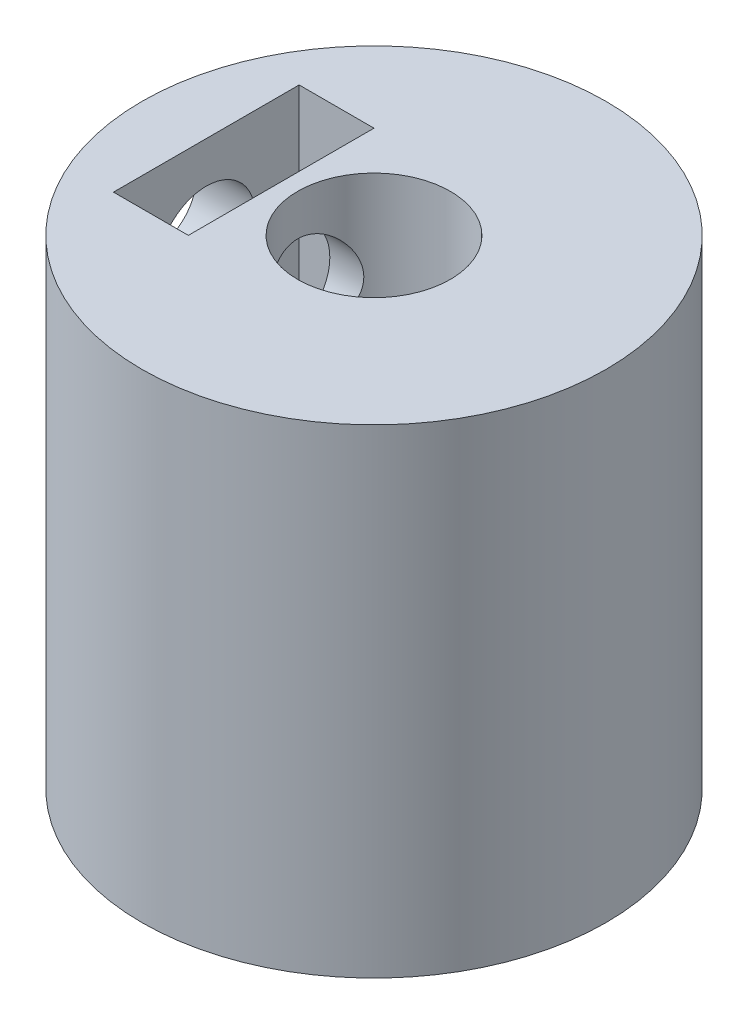
ISO-10303-21;
HEADER;
FILE_DESCRIPTION(('STEP AP214'),'2;1');
FILE_NAME('part.step','',(''),(''),'','','');
FILE_SCHEMA(('AUTOMOTIVE_DESIGN { 1 0 10303 214 1 1 1 1 }'));
ENDSEC;
DATA;
#1=APPLICATION_CONTEXT('core data for automotive mechanical design processes');
#2=APPLICATION_PROTOCOL_DEFINITION('international standard','automotive_design',2000,#1);
#3=PRODUCT_CONTEXT('',#1,'mechanical');
#4=PRODUCT('Part','Part','',(#3));
#5=PRODUCT_RELATED_PRODUCT_CATEGORY('part','',(#4));
#6=PRODUCT_DEFINITION_FORMATION('','',#4);
#7=PRODUCT_DEFINITION_CONTEXT('part definition',#1,'design');
#8=PRODUCT_DEFINITION('design','',#6,#7);
#9=PRODUCT_DEFINITION_SHAPE('','',#8);
#10=(LENGTH_UNIT() NAMED_UNIT(*) SI_UNIT(.MILLI.,.METRE.));
#11=(NAMED_UNIT(*) PLANE_ANGLE_UNIT() SI_UNIT($,.RADIAN.));
#12=(NAMED_UNIT(*) SI_UNIT($,.STERADIAN.) SOLID_ANGLE_UNIT());
#13=UNCERTAINTY_MEASURE_WITH_UNIT(LENGTH_MEASURE(1.E-05),#10,'distance_accuracy_value','');
#14=(GEOMETRIC_REPRESENTATION_CONTEXT(3) GLOBAL_UNCERTAINTY_ASSIGNED_CONTEXT((#13)) GLOBAL_UNIT_ASSIGNED_CONTEXT((#10,
#11,#12)) REPRESENTATION_CONTEXT('',''));
#15=CARTESIAN_POINT('',(0.,0.,0.));
#16=DIRECTION('',(0.,0.,1.));
#17=DIRECTION('',(1.,0.,0.));
#18=AXIS2_PLACEMENT_3D('',#15,#16,#17);
#19=CARTESIAN_POINT('',(0.,8.,0.));
#20=DIRECTION('',(0.,1.,0.));
#21=DIRECTION('',(0.,0.,1.));
#22=AXIS2_PLACEMENT_3D('',#19,#20,#21);
#23=PLANE('',#22);
#24=CARTESIAN_POINT('',(0.,8.,0.));
#25=DIRECTION('',(0.,1.,0.));
#26=DIRECTION('',(0.,0.,1.));
#27=AXIS2_PLACEMENT_3D('',#24,#25,#26);
#28=CIRCLE('',#27,2.55);
#29=CARTESIAN_POINT('',(0.,8.,2.55));
#30=VERTEX_POINT('',#29);
#31=EDGE_CURVE('E231',#30,#30,#28,.T.);
#32=ORIENTED_EDGE('',*,*,#31,.F.);
#33=EDGE_LOOP('',(#32));
#34=FACE_BOUND('',#33,.T.);
#35=CARTESIAN_POINT('',(0.,8.,0.));
#36=DIRECTION('',(0.,1.,0.));
#37=DIRECTION('',(0.,0.,1.));
#38=AXIS2_PLACEMENT_3D('',#35,#36,#37);
#39=CIRCLE('',#38,7.75);
#40=CARTESIAN_POINT('',(0.,8.,7.75));
#41=VERTEX_POINT('',#40);
#42=EDGE_CURVE('E235',#41,#41,#39,.T.);
#43=ORIENTED_EDGE('',*,*,#42,.T.);
#44=EDGE_LOOP('',(#43));
#45=FACE_BOUND('',#44,.T.);
#46=DIRECTION('',(1.,0.,0.));
#47=VECTOR('',#46,1.);
#48=CARTESIAN_POINT('',(-5.6,8.,3.1));
#49=LINE('',#48,#47);
#50=CARTESIAN_POINT('',(-5.6,8.,3.1));
#51=VERTEX_POINT('',#50);
#52=CARTESIAN_POINT('',(-3.1,8.,3.1));
#53=VERTEX_POINT('',#52);
#54=EDGE_CURVE('E140',#51,#53,#49,.T.);
#55=ORIENTED_EDGE('',*,*,#54,.F.);
#56=DIRECTION('',(0.,0.,1.));
#57=VECTOR('',#56,1.);
#58=CARTESIAN_POINT('',(-5.6,8.,-3.1));
#59=LINE('',#58,#57);
#60=CARTESIAN_POINT('',(-5.6,8.,-3.1));
#61=VERTEX_POINT('',#60);
#62=EDGE_CURVE('E113',#61,#51,#59,.T.);
#63=ORIENTED_EDGE('',*,*,#62,.F.);
#64=DIRECTION('',(1.,0.,0.));
#65=VECTOR('',#64,1.);
#66=CARTESIAN_POINT('',(-5.6,8.,-3.1));
#67=LINE('',#66,#65);
#68=CARTESIAN_POINT('',(-3.1,8.,-3.1));
#69=VERTEX_POINT('',#68);
#70=EDGE_CURVE('E143',#61,#69,#67,.T.);
#71=ORIENTED_EDGE('',*,*,#70,.T.);
#72=DIRECTION('',(0.,0.,1.));
#73=VECTOR('',#72,1.);
#74=CARTESIAN_POINT('',(-3.1,8.,-3.1));
#75=LINE('',#74,#73);
#76=EDGE_CURVE('E127',#69,#53,#75,.T.);
#77=ORIENTED_EDGE('',*,*,#76,.T.);
#78=EDGE_LOOP('',(#55,#63,#71,#77));
#79=FACE_BOUND('',#78,.T.);
#80=ADVANCED_FACE('F34',(#34,#45,#79),#23,.T.);
#81=CARTESIAN_POINT('',(-20.5,-5.,0.));
#82=DIRECTION('',(1.,0.,0.));
#83=DIRECTION('',(0.,0.,-1.));
#84=AXIS2_PLACEMENT_3D('',#81,#82,#83);
#85=CYLINDRICAL_SURFACE('',#84,1.625);
#86=CARTESIAN_POINT('',(-1.96516538744198,-5.,-1.625));
#87=CARTESIAN_POINT('',(-1.9651777495956,-5.08038266060624,-1.62499241951799));
#88=CARTESIAN_POINT('',(-1.97018801485205,-5.16083573427423,-1.61898407358667));
#89=CARTESIAN_POINT('',(-1.98931986532997,-5.31895886035241,-1.59540502363238));
#90=CARTESIAN_POINT('',(-2.00345932830343,-5.3966231357439,-1.57781163121016));
#91=CARTESIAN_POINT('',(-2.03842904176531,-5.54643663047045,-1.53235534627922));
#92=CARTESIAN_POINT('',(-2.05920047044041,-5.61862767694942,-1.50458243140975));
#93=CARTESIAN_POINT('',(-2.10499227311706,-5.75723612790105,-1.43981883091727));
#94=CARTESIAN_POINT('',(-2.13001351438201,-5.82365234970856,-1.4028262631091));
#95=CARTESIAN_POINT('',(-2.185704877213,-5.95903991323918,-1.31463952129205));
#96=CARTESIAN_POINT('',(-2.21667522302638,-6.02706482324539,-1.26218160511581));
#97=CARTESIAN_POINT('',(-2.27834675013153,-6.15415559751042,-1.14712897760829));
#98=CARTESIAN_POINT('',(-2.30904767433442,-6.2132136306856,-1.08452550332085));
#99=CARTESIAN_POINT('',(-2.37133975131212,-6.32815609653209,-0.941322199016962));
#100=CARTESIAN_POINT('',(-2.40254675703229,-6.38267959358617,-0.859445953513414));
#101=CARTESIAN_POINT('',(-2.45787725112131,-6.47672970567766,-0.685312447786562));
#102=CARTESIAN_POINT('',(-2.48200797005701,-6.5162716410635,-0.593065918254888));
#103=CARTESIAN_POINT('',(-2.51818797230923,-6.57475837972704,-0.410998491877256));
#104=CARTESIAN_POINT('',(-2.53123793769468,-6.59542672919694,-0.321935516470099));
#105=CARTESIAN_POINT('',(-2.54772965090739,-6.62146800801774,-0.140761256765256));
#106=CARTESIAN_POINT('',(-2.55118205611016,-6.6268579030849,-0.0486534686486843));
#107=CARTESIAN_POINT('',(-2.5483042190585,-6.62233624860543,0.122107713885255));
#108=CARTESIAN_POINT('',(-2.54327016245075,-6.61445231398725,0.200847370748513));
#109=CARTESIAN_POINT('',(-2.52628056532954,-6.58755402290214,0.355619536125331));
#110=CARTESIAN_POINT('',(-2.51432450485016,-6.56853883027805,0.431651840812965));
#111=CARTESIAN_POINT('',(-2.48449603879295,-6.52026463148926,0.579186024340183));
#112=CARTESIAN_POINT('',(-2.46661890290692,-6.49099743398483,0.650684226325551));
#113=CARTESIAN_POINT('',(-2.42631281008093,-6.42332594326026,0.787793877596566));
#114=CARTESIAN_POINT('',(-2.40388288280599,-6.38491970193741,0.853404067666017));
#115=CARTESIAN_POINT('',(-2.35294468811187,-6.29461932898805,0.985797470965052));
#116=CARTESIAN_POINT('',(-2.32402636903217,-6.24163289726313,1.05167642035341));
#117=CARTESIAN_POINT('',(-2.26460512659315,-6.12649695438483,1.17418544351358));
#118=CARTESIAN_POINT('',(-2.23409988554345,-6.06433378266232,1.23080145884505));
#119=CARTESIAN_POINT('',(-2.16990067600904,-5.92257130839874,1.34113248943147));
#120=CARTESIAN_POINT('',(-2.13634692324536,-5.84174969270578,1.39337138672418));
#121=CARTESIAN_POINT('',(-2.07487148297598,-5.67048727014074,1.48336973768388));
#122=CARTESIAN_POINT('',(-2.04693960621195,-5.58006432795841,1.52115550068513));
#123=CARTESIAN_POINT('',(-2.00780033110716,-5.4169471671801,1.57225368592951));
#124=CARTESIAN_POINT('',(-1.99411349186395,-5.3460592686623,1.58941949060232));
#125=CARTESIAN_POINT('',(-1.97419525844224,-5.20163992820011,1.614098206648));
#126=CARTESIAN_POINT('',(-1.9679528970052,-5.12811253980566,1.6216253190217));
#127=CARTESIAN_POINT('',(-1.96387189510528,-4.98026741916364,1.62656707381513));
#128=CARTESIAN_POINT('',(-1.96605694958116,-4.9059480452365,1.62395320322417));
#129=CARTESIAN_POINT('',(-1.97852813965092,-4.75901232691797,1.60873120169692));
#130=CARTESIAN_POINT('',(-1.98882105007509,-4.68639745907041,1.59611471263157));
#131=CARTESIAN_POINT('',(-2.0156623096275,-4.5465372842733,1.56206732730421));
#132=CARTESIAN_POINT('',(-2.03204725076701,-4.47920297189759,1.54086549818665));
#133=CARTESIAN_POINT('',(-2.06926910903875,-4.34891995312157,1.49050450986105));
#134=CARTESIAN_POINT('',(-2.09010750935643,-4.2859727170831,1.46134269875178));
#135=CARTESIAN_POINT('',(-2.13876923763544,-4.15325169888539,1.38938681685538));
#136=CARTESIAN_POINT('',(-2.16716310249829,-4.08452687168844,1.34504506764347));
#137=CARTESIAN_POINT('',(-2.22511188320518,-3.95471319008126,1.24685008499367));
#138=CARTESIAN_POINT('',(-2.25466814026529,-3.89363351818756,1.19298559762631));
#139=CARTESIAN_POINT('',(-2.31772916194698,-3.76983215740194,1.06606595014288));
#140=CARTESIAN_POINT('',(-2.3510084294412,-3.70872853343524,0.991301594544217));
#141=CARTESIAN_POINT('',(-2.41243358452782,-3.6000115699649,0.830680905234968));
#142=CARTESIAN_POINT('',(-2.44058516683697,-3.55238323210329,0.744837059562022));
#143=CARTESIAN_POINT('',(-2.48378930835388,-3.48079905354294,0.582145592184213));
#144=CARTESIAN_POINT('',(-2.50033614870532,-3.45401248797799,0.506939961842522));
#145=CARTESIAN_POINT('',(-2.52675699754254,-3.41163502773412,0.352323981537021));
#146=CARTESIAN_POINT('',(-2.53663632844209,-3.39603520249127,0.27291704005655));
#147=CARTESIAN_POINT('',(-2.54883100043065,-3.37681776670653,0.111819355355441));
#148=CARTESIAN_POINT('',(-2.55112241160253,-3.37323806335995,0.03012220483019));
#149=CARTESIAN_POINT('',(-2.54784530754677,-3.37838206339879,-0.132729217797065));
#150=CARTESIAN_POINT('',(-2.54227610025932,-3.3871068500886,-0.213883441466977));
#151=CARTESIAN_POINT('',(-2.52428609288949,-3.41562039634327,-0.369179388768185));
#152=CARTESIAN_POINT('',(-2.51221871401568,-3.4348391101114,-0.443469296679646));
#153=CARTESIAN_POINT('',(-2.48247015925824,-3.48304847458908,-0.587589897126411));
#154=CARTESIAN_POINT('',(-2.46478807116174,-3.5120407132349,-0.657419862846109));
#155=CARTESIAN_POINT('',(-2.42355384453705,-3.58134764803054,-0.796589314418045));
#156=CARTESIAN_POINT('',(-2.39965365250793,-3.62236423324208,-0.865473796637177));
#157=CARTESIAN_POINT('',(-2.34860040455858,-3.7133503860364,-0.995731034656254));
#158=CARTESIAN_POINT('',(-2.32144472488567,-3.76332719138044,-1.0570976498193));
#159=CARTESIAN_POINT('',(-2.26155128443658,-3.87947010391925,-1.18036511761868));
#160=CARTESIAN_POINT('',(-2.22859227356778,-3.94694225405403,-1.24093057122332));
#161=CARTESIAN_POINT('',(-2.16405507864855,-4.09146381250273,-1.35033345227475));
#162=CARTESIAN_POINT('',(-2.13247726229956,-4.16851575042024,-1.39916777201742));
#163=CARTESIAN_POINT('',(-2.0786664944871,-4.31941450852961,-1.47769207063656));
#164=CARTESIAN_POINT('',(-2.0557424072431,-4.39210023492175,-1.50913274574658));
#165=CARTESIAN_POINT('',(-2.01635737214433,-4.54277214100537,-1.56137263897716));
#166=CARTESIAN_POINT('',(-1.99987938851511,-4.62074370179198,-1.58219995086419));
#167=CARTESIAN_POINT('',(-1.98047635297883,-4.74946249557526,-1.60634636463587));
#168=CARTESIAN_POINT('',(-1.97477575032653,-4.79912914964704,-1.61331920529646));
#169=CARTESIAN_POINT('',(-1.96711625613034,-4.89918793347215,-1.62264856616414));
#170=CARTESIAN_POINT('',(-1.96515763330249,-4.94958011506469,-1.62500475484424));
#171=CARTESIAN_POINT('',(-1.96516538744198,-5.,-1.625));
#172=B_SPLINE_CURVE_WITH_KNOTS('',3,(#86,#87,#88,#89,#90,#91,#92,#93,#94,#95,#96,#97,#98,#99,
#100,#101,#102,#103,#104,#105,#106,#107,#108,#109,#110,#111,#112,#113,#114,#115,#116,#117,#118,
#119,#120,#121,#122,#123,#124,#125,#126,#127,#128,#129,#130,#131,#132,#133,#134,#135,#136,#137,
#138,#139,#140,#141,#142,#143,#144,#145,#146,#147,#148,#149,#150,#151,#152,#153,#154,#155,#156,
#157,#158,#159,#160,#161,#162,#163,#164,#165,#166,#167,#168,#169,#170,#171),.UNSPECIFIED.,.T.,
.F.,(4,2,2,2,2,2,2,2,2,2,2,2,2,2,2,2,2,2,2,2,2,2,2,2,2,2,2,2,2,2,2,2,2,2,2,2,2,2,2,2,2,2,4),(0.,
0.240920473653112,0.482314179923977,0.721623709846711,0.960982134704146,1.23388638722119,
1.50702762225861,1.81493799229473,2.12253263364239,2.39790990977056,2.67298127757442,
2.90972101410114,3.14647853631163,3.38342566062039,3.62042333852061,3.88744329531325,
4.15486482502625,4.45915564708659,4.76288989602745,4.98460375980739,5.20599058802883,
5.42800033155198,5.65019578087639,5.8668170170039,6.08351050967008,6.34229449512456,
6.60138638002577,6.90627441951303,7.21082176324551,7.45436980670092,7.69772320453123,
7.94184333537599,8.18598496023823,8.41802108232316,8.65009492225344,8.90010468187649,
9.15031730829315,9.43854552693216,9.72685001634639,9.97326281223881,10.2190199159535,
10.3701260159542,10.5212429666564),.UNSPECIFIED.);
#173=CARTESIAN_POINT('',(-1.96516538744198,-5.,-1.625));
#174=VERTEX_POINT('',#173);
#175=EDGE_CURVE('E176',#174,#174,#172,.T.);
#176=ORIENTED_EDGE('',*,*,#175,.F.);
#177=EDGE_LOOP('',(#176));
#178=FACE_BOUND('',#177,.T.);
#179=CARTESIAN_POINT('',(-3.1,-5.,0.));
#180=DIRECTION('',(-1.,0.,0.));
#181=DIRECTION('',(0.,0.,1.));
#182=AXIS2_PLACEMENT_3D('',#179,#180,#181);
#183=CIRCLE('',#182,1.625);
#184=CARTESIAN_POINT('',(-3.1,-5.,1.625));
#185=VERTEX_POINT('',#184);
#186=EDGE_CURVE('E279',#185,#185,#183,.F.);
#187=ORIENTED_EDGE('',*,*,#186,.F.);
#188=EDGE_LOOP('',(#187));
#189=FACE_BOUND('',#188,.T.);
#190=ADVANCED_FACE('F196',(#178,#189),#85,.F.);
#191=CARTESIAN_POINT('',(-20.5,5.,0.));
#192=DIRECTION('',(1.,0.,0.));
#193=DIRECTION('',(0.,0.,-1.));
#194=AXIS2_PLACEMENT_3D('',#191,#192,#193);
#195=CYLINDRICAL_SURFACE('',#194,1.625);
#196=CARTESIAN_POINT('',(-7.57772228311384,5.,-1.625));
#197=CARTESIAN_POINT('',(-7.5777240985674,4.90980612938822,-1.62499677846791));
#198=CARTESIAN_POINT('',(-7.57935010639968,4.81957263816137,-1.61746530750281));
#199=CARTESIAN_POINT('',(-7.58566768965246,4.64166509219679,-1.58756748986125));
#200=CARTESIAN_POINT('',(-7.59036159795978,4.55399303826648,-1.56518985369802));
#201=CARTESIAN_POINT('',(-7.60226052986961,4.38380777292506,-1.50632978558656));
#202=CARTESIAN_POINT('',(-7.60946292496147,4.30128926770581,-1.46986211348495));
#203=CARTESIAN_POINT('',(-7.6255641585604,4.14354185603373,-1.38389852226216));
#204=CARTESIAN_POINT('',(-7.63446293278317,4.06831267351487,-1.33440309680066));
#205=CARTESIAN_POINT('',(-7.65310867348377,3.92610840921211,-1.2229695302804));
#206=CARTESIAN_POINT('',(-7.66286573582819,3.85926303096892,-1.16086753177424));
#207=CARTESIAN_POINT('',(-7.6820400615856,3.73685803498958,-1.02633755019323));
#208=CARTESIAN_POINT('',(-7.69145729984884,3.68129925115017,-0.953908804811147));
#209=CARTESIAN_POINT('',(-7.70900034281084,3.58253628572523,-0.799916946308263));
#210=CARTESIAN_POINT('',(-7.71711284966997,3.53945612200807,-0.718272649062821));
#211=CARTESIAN_POINT('',(-7.73101863903009,3.46767460440972,-0.548705453244297));
#212=CARTESIAN_POINT('',(-7.73681216037019,3.43897176968874,-0.46078320235573));
#213=CARTESIAN_POINT('',(-7.74535587107382,3.39716556677439,-0.282503297755103));
#214=CARTESIAN_POINT('',(-7.74814879992281,3.3838429179729,-0.19219914735783));
#215=CARTESIAN_POINT('',(-7.7505244862857,3.37249038642778,-0.0105972239904142));
#216=CARTESIAN_POINT('',(-7.75010758246493,3.37445889033442,0.0807004431400752));
#217=CARTESIAN_POINT('',(-7.74614346525646,3.39346798740791,0.260188543333904));
#218=CARTESIAN_POINT('',(-7.74264532621138,3.41027230262892,0.348405242395991));
#219=CARTESIAN_POINT('',(-7.73296741782681,3.45810035648581,0.520738127781115));
#220=CARTESIAN_POINT('',(-7.72678753390875,3.48912470268112,0.604854138729862));
#221=CARTESIAN_POINT('',(-7.71236061700763,3.5647260127636,0.767262757166831));
#222=CARTESIAN_POINT('',(-7.70409976496751,3.60939401904542,0.845511706575586));
#223=CARTESIAN_POINT('',(-7.68641913202151,3.71094706327619,0.993490219864544));
#224=CARTESIAN_POINT('',(-7.67699920533503,3.76783363866674,1.06321870989608));
#225=CARTESIAN_POINT('',(-7.65782580019511,3.89350028853116,1.19358077310528));
#226=CARTESIAN_POINT('',(-7.64806938844876,3.96248716324062,1.25401472712169));
#227=CARTESIAN_POINT('',(-7.62949257097781,4.10971631752945,1.36249068667844));
#228=CARTESIAN_POINT('',(-7.62067218665188,4.18795880861655,1.41053240895381));
#229=CARTESIAN_POINT('',(-7.60495928947352,4.35178305076718,1.49293899762853));
#230=CARTESIAN_POINT('',(-7.59807172955438,4.43738293606686,1.52726882027231));
#231=CARTESIAN_POINT('',(-7.58707480980913,4.61331447570656,1.58099831702467));
#232=CARTESIAN_POINT('',(-7.58296504847615,4.70364544417463,1.6004001489019));
#233=CARTESIAN_POINT('',(-7.57807023476042,4.88465827216149,1.62341888026088));
#234=CARTESIAN_POINT('',(-7.57722421932893,4.9753017133911,1.62732525677477));
#235=CARTESIAN_POINT('',(-7.57878863607987,5.15594479139954,1.62002356266211));
#236=CARTESIAN_POINT('',(-7.58119886399272,5.24594446820674,1.60881644013064));
#237=CARTESIAN_POINT('',(-7.58894686243375,5.421754627027,1.5718562580192));
#238=CARTESIAN_POINT('',(-7.59425300143189,5.50759965280842,1.54626027631592));
#239=CARTESIAN_POINT('',(-7.60716681400428,5.67378275629721,1.48141797669998));
#240=CARTESIAN_POINT('',(-7.61477469293367,5.75412034186062,1.44217044078508));
#241=CARTESIAN_POINT('',(-7.63157019935227,5.90826769444377,1.35049273790077));
#242=CARTESIAN_POINT('',(-7.6407787740078,5.9819682518236,1.29788285964264));
#243=CARTESIAN_POINT('',(-7.65968176513589,6.11960085464079,1.18121118680818));
#244=CARTESIAN_POINT('',(-7.66937623673157,6.18353178840615,1.11714809078303));
#245=CARTESIAN_POINT('',(-7.68835813076449,6.30092109485276,0.978083679473011));
#246=CARTESIAN_POINT('',(-7.69763582885341,6.35418290971259,0.902914895278869));
#247=CARTESIAN_POINT('',(-7.71456487234521,6.44732212349006,0.744528441854027));
#248=CARTESIAN_POINT('',(-7.72221629015498,6.48720011834149,0.661311131208109));
#249=CARTESIAN_POINT('',(-7.73498939989242,6.55215963558376,0.489685226864576));
#250=CARTESIAN_POINT('',(-7.7401263003472,6.57733029621641,0.401311554284328));
#251=CARTESIAN_POINT('',(-7.74735708878321,6.61244112609945,0.221471131762615));
#252=CARTESIAN_POINT('',(-7.74945138148628,6.62238332102063,0.130004794857988));
#253=CARTESIAN_POINT('',(-7.7503501745671,6.62667013099461,-0.0515530071449035));
#254=CARTESIAN_POINT('',(-7.74921678291357,6.62130920801281,-0.141637340050361));
#255=CARTESIAN_POINT('',(-7.74391939476256,6.5957964196842,-0.319590781652004));
#256=CARTESIAN_POINT('',(-7.73975544439363,6.57564477946891,-0.407459924044848));
#257=CARTESIAN_POINT('',(-7.7288680052786,6.52125874863281,-0.578282734842553));
#258=CARTESIAN_POINT('',(-7.72215154128057,6.48706298804688,-0.661249178217704));
#259=CARTESIAN_POINT('',(-7.70687919950167,6.40559834655363,-0.820307571843223));
#260=CARTESIAN_POINT('',(-7.69832315919027,6.35832831040004,-0.896398913819322));
#261=CARTESIAN_POINT('',(-7.68011997264632,6.251080388421,-1.04099332934323));
#262=CARTESIAN_POINT('',(-7.67045628344102,6.19089362901473,-1.10933941149133));
#263=CARTESIAN_POINT('',(-7.65122048756383,6.05994600779843,-1.23506262949101));
#264=CARTESIAN_POINT('',(-7.6416484033065,5.98918262502979,-1.29243714279608));
#265=CARTESIAN_POINT('',(-7.62355164406141,5.83806479328225,-1.39525110102643));
#266=CARTESIAN_POINT('',(-7.61504099889615,5.75760493193397,-1.44053820312803));
#267=CARTESIAN_POINT('',(-7.6002045222795,5.59005832488821,-1.51687684507225));
#268=CARTESIAN_POINT('',(-7.59387677687254,5.50297746663818,-1.54794086350527));
#269=CARTESIAN_POINT('',(-7.58533879247895,5.34646065028059,-1.58916832656139));
#270=CARTESIAN_POINT('',(-7.58250093053033,5.2778960828852,-1.60258029998948));
#271=CARTESIAN_POINT('',(-7.57869201196152,5.1395622184809,-1.62049719933572));
#272=CARTESIAN_POINT('',(-7.57772087829666,5.06979297131213,-1.62500249285561));
#273=CARTESIAN_POINT('',(-7.57772228311384,5.,-1.625));
#274=B_SPLINE_CURVE_WITH_KNOTS('',3,(#196,#197,#198,#199,#200,#201,#202,#203,#204,#205,#206,
#207,#208,#209,#210,#211,#212,#213,#214,#215,#216,#217,#218,#219,#220,#221,#222,#223,#224,#225,
#226,#227,#228,#229,#230,#231,#232,#233,#234,#235,#236,#237,#238,#239,#240,#241,#242,#243,#244,
#245,#246,#247,#248,#249,#250,#251,#252,#253,#254,#255,#256,#257,#258,#259,#260,#261,#262,#263,
#264,#265,#266,#267,#268,#269,#270,#271,#272,#273),.UNSPECIFIED.,.T.,.F.,(4,2,2,2,2,2,2,2,2,2,2,
2,2,2,2,2,2,2,2,2,2,2,2,2,2,2,2,2,2,2,2,2,2,2,2,2,2,2,4),(0.,0.270325947544355,
0.540857695344336,0.811106815882805,1.08134569736544,1.35535229808911,1.62937913611108,
1.90604262144064,2.18267760505155,2.45531780639069,2.72792924220589,2.99627579304201,
3.26463381021583,3.53482318510633,3.80504657739992,4.08044200282473,4.35584372275439,
4.63194485613665,4.90800607293782,5.17888508226157,5.44974709968215,5.71770808619433,
5.98569298652814,6.25749286223622,6.52932364268477,6.80577658336896,7.08221721295594,
7.35696452977387,7.63167529688486,7.90113592558165,8.17059245286667,8.43931271950336,
8.70805673791956,8.98152719077663,9.25506293009889,9.53189876613255,9.8084912532608,
10.0176809654452,10.2268620436483),.UNSPECIFIED.);
#275=CARTESIAN_POINT('',(-7.57772228311384,5.,-1.625));
#276=VERTEX_POINT('',#275);
#277=EDGE_CURVE('E182',#276,#276,#274,.T.);
#278=ORIENTED_EDGE('',*,*,#277,.T.);
#279=EDGE_LOOP('',(#278));
#280=FACE_BOUND('',#279,.T.);
#281=CARTESIAN_POINT('',(-5.6,5.,0.));
#282=DIRECTION('',(1.,0.,0.));
#283=DIRECTION('',(0.,0.,-1.));
#284=AXIS2_PLACEMENT_3D('',#281,#282,#283);
#285=CIRCLE('',#284,1.625);
#286=CARTESIAN_POINT('',(-5.6,5.,-1.625));
#287=VERTEX_POINT('',#286);
#288=EDGE_CURVE('E281',#287,#287,#285,.F.);
#289=ORIENTED_EDGE('',*,*,#288,.F.);
#290=EDGE_LOOP('',(#289));
#291=FACE_BOUND('',#290,.T.);
#292=ADVANCED_FACE('F226',(#280,#291),#195,.F.);
#293=CARTESIAN_POINT('',(0.,-8.,0.));
#294=DIRECTION('',(0.,1.,0.));
#295=DIRECTION('',(0.,0.,1.));
#296=AXIS2_PLACEMENT_3D('',#293,#294,#295);
#297=CYLINDRICAL_SURFACE('',#296,2.55);
#298=CARTESIAN_POINT('',(-1.96516538744198,5.,-1.625));
#299=CARTESIAN_POINT('',(-1.9651777495956,4.91961733939376,-1.62499241951799));
#300=CARTESIAN_POINT('',(-1.97018801485205,4.83916426572578,-1.61898407358667));
#301=CARTESIAN_POINT('',(-1.98931986532997,4.68104113964759,-1.59540502363238));
#302=CARTESIAN_POINT('',(-2.00345932830343,4.6033768642561,-1.57781163121016));
#303=CARTESIAN_POINT('',(-2.03842904176531,4.45356336952955,-1.53235534627922));
#304=CARTESIAN_POINT('',(-2.05920047044041,4.38137232305058,-1.50458243140975));
#305=CARTESIAN_POINT('',(-2.10499227311706,4.24276387209895,-1.43981883091727));
#306=CARTESIAN_POINT('',(-2.13001351438201,4.17634765029144,-1.4028262631091));
#307=CARTESIAN_POINT('',(-2.185704877213,4.04096008676082,-1.31463952129205));
#308=CARTESIAN_POINT('',(-2.21667522302638,3.97293517675461,-1.26218160511581));
#309=CARTESIAN_POINT('',(-2.27834675013153,3.84584440248958,-1.14712897760829));
#310=CARTESIAN_POINT('',(-2.30904767433443,3.7867863693144,-1.08452550332085));
#311=CARTESIAN_POINT('',(-2.37133975131212,3.67184390346791,-0.941322199016962));
#312=CARTESIAN_POINT('',(-2.40254675703229,3.61732040641383,-0.859445953513413));
#313=CARTESIAN_POINT('',(-2.45787725112131,3.52327029432234,-0.685312447786562));
#314=CARTESIAN_POINT('',(-2.48200797005701,3.4837283589365,-0.593065918254888));
#315=CARTESIAN_POINT('',(-2.51818797230924,3.42524162027296,-0.410998491877255));
#316=CARTESIAN_POINT('',(-2.53123793769468,3.40457327080306,-0.321935516470098));
#317=CARTESIAN_POINT('',(-2.54772965090739,3.37853199198226,-0.140761256765255));
#318=CARTESIAN_POINT('',(-2.55118205611016,3.3731420969151,-0.0486534686486836));
#319=CARTESIAN_POINT('',(-2.5483042190585,3.37766375139457,0.122107713885256));
#320=CARTESIAN_POINT('',(-2.54327016245075,3.38554768601275,0.200847370748514));
#321=CARTESIAN_POINT('',(-2.52628056532954,3.41244597709786,0.355619536125332));
#322=CARTESIAN_POINT('',(-2.51432450485016,3.43146116972196,0.431651840812966));
#323=CARTESIAN_POINT('',(-2.48449603879295,3.47973536851074,0.579186024340183));
#324=CARTESIAN_POINT('',(-2.46661890290692,3.50900256601517,0.650684226325551));
#325=CARTESIAN_POINT('',(-2.42631281008093,3.57667405673974,0.787793877596567));
#326=CARTESIAN_POINT('',(-2.403882882806,3.61508029806259,0.853404067666018));
#327=CARTESIAN_POINT('',(-2.35294468811187,3.70538067101195,0.985797470965052));
#328=CARTESIAN_POINT('',(-2.32402636903217,3.75836710273687,1.05167642035341));
#329=CARTESIAN_POINT('',(-2.26460512659315,3.87350304561517,1.17418544351358));
#330=CARTESIAN_POINT('',(-2.23409988554345,3.93566621733768,1.23080145884505));
#331=CARTESIAN_POINT('',(-2.16990067600904,4.07742869160126,1.34113248943147));
#332=CARTESIAN_POINT('',(-2.13634692324536,4.15825030729422,1.39337138672418));
#333=CARTESIAN_POINT('',(-2.07487148297598,4.32951272985926,1.48336973768388));
#334=CARTESIAN_POINT('',(-2.04693960621195,4.41993567204159,1.52115550068513));
#335=CARTESIAN_POINT('',(-2.00780033110716,4.5830528328199,1.57225368592951));
#336=CARTESIAN_POINT('',(-1.99411349186395,4.6539407313377,1.58941949060232));
#337=CARTESIAN_POINT('',(-1.97419525844224,4.79836007179989,1.614098206648));
#338=CARTESIAN_POINT('',(-1.9679528970052,4.87188746019434,1.6216253190217));
#339=CARTESIAN_POINT('',(-1.96387189510528,5.01973258083636,1.62656707381513));
#340=CARTESIAN_POINT('',(-1.96605694958116,5.0940519547635,1.62395320322417));
#341=CARTESIAN_POINT('',(-1.97852813965092,5.24098767308203,1.60873120169692));
#342=CARTESIAN_POINT('',(-1.98882105007509,5.31360254092959,1.59611471263157));
#343=CARTESIAN_POINT('',(-2.0156623096275,5.4534627157267,1.56206732730421));
#344=CARTESIAN_POINT('',(-2.03204725076701,5.52079702810241,1.54086549818665));
#345=CARTESIAN_POINT('',(-2.06926910903875,5.65108004687843,1.49050450986105));
#346=CARTESIAN_POINT('',(-2.09010750935643,5.7140272829169,1.46134269875178));
#347=CARTESIAN_POINT('',(-2.13876923763544,5.84674830111461,1.38938681685538));
#348=CARTESIAN_POINT('',(-2.16716310249829,5.91547312831156,1.34504506764347));
#349=CARTESIAN_POINT('',(-2.22511188320518,6.04528680991874,1.24685008499367));
#350=CARTESIAN_POINT('',(-2.25466814026529,6.10636648181244,1.19298559762632));
#351=CARTESIAN_POINT('',(-2.31772916194697,6.23016784259806,1.06606595014288));
#352=CARTESIAN_POINT('',(-2.3510084294412,6.29127146656476,0.991301594544218));
#353=CARTESIAN_POINT('',(-2.41243358452782,6.3999884300351,0.83068090523497));
#354=CARTESIAN_POINT('',(-2.44058516683697,6.44761676789671,0.744837059562023));
#355=CARTESIAN_POINT('',(-2.48378930835387,6.51920094645706,0.582145592184214));
#356=CARTESIAN_POINT('',(-2.50033614870532,6.54598751202201,0.506939961842523));
#357=CARTESIAN_POINT('',(-2.52675699754254,6.58836497226588,0.352323981537022));
#358=CARTESIAN_POINT('',(-2.53663632844209,6.60396479750873,0.272917040056551));
#359=CARTESIAN_POINT('',(-2.54883100043065,6.62318223329347,0.111819355355441));
#360=CARTESIAN_POINT('',(-2.55112241160253,6.62676193664005,0.0301222048301897));
#361=CARTESIAN_POINT('',(-2.54784530754677,6.62161793660121,-0.132729217797066));
#362=CARTESIAN_POINT('',(-2.54227610025932,6.6128931499114,-0.213883441466978));
#363=CARTESIAN_POINT('',(-2.52428609288949,6.58437960365673,-0.369179388768185));
#364=CARTESIAN_POINT('',(-2.51221871401568,6.5651608898886,-0.443469296679646));
#365=CARTESIAN_POINT('',(-2.48247015925824,6.51695152541092,-0.587589897126411));
#366=CARTESIAN_POINT('',(-2.46478807116174,6.4879592867651,-0.657419862846109));
#367=CARTESIAN_POINT('',(-2.42355384453705,6.41865235196946,-0.796589314418046));
#368=CARTESIAN_POINT('',(-2.39965365250793,6.37763576675792,-0.865473796637178));
#369=CARTESIAN_POINT('',(-2.34860040455858,6.2866496139636,-0.995731034656255));
#370=CARTESIAN_POINT('',(-2.32144472488567,6.23667280861956,-1.0570976498193));
#371=CARTESIAN_POINT('',(-2.26155128443658,6.12052989608075,-1.18036511761869));
#372=CARTESIAN_POINT('',(-2.22859227356778,6.05305774594598,-1.24093057122332));
#373=CARTESIAN_POINT('',(-2.16405507864855,5.90853618749727,-1.35033345227475));
#374=CARTESIAN_POINT('',(-2.13247726229956,5.83148424957976,-1.39916777201742));
#375=CARTESIAN_POINT('',(-2.0786664944871,5.68058549147039,-1.47769207063656));
#376=CARTESIAN_POINT('',(-2.0557424072431,5.60789976507825,-1.50913274574658));
#377=CARTESIAN_POINT('',(-2.01635737214433,5.45722785899463,-1.56137263897716));
#378=CARTESIAN_POINT('',(-1.99987938851511,5.37925629820802,-1.58219995086419));
#379=CARTESIAN_POINT('',(-1.98047635297883,5.25053750442474,-1.60634636463587));
#380=CARTESIAN_POINT('',(-1.97477575032653,5.20087085035296,-1.61331920529646));
#381=CARTESIAN_POINT('',(-1.96711625613034,5.10081206652785,-1.62264856616414));
#382=CARTESIAN_POINT('',(-1.96515763330249,5.05041988493531,-1.62500475484424));
#383=CARTESIAN_POINT('',(-1.96516538744198,5.,-1.625));
#384=B_SPLINE_CURVE_WITH_KNOTS('',3,(#298,#299,#300,#301,#302,#303,#304,#305,#306,#307,#308,
#309,#310,#311,#312,#313,#314,#315,#316,#317,#318,#319,#320,#321,#322,#323,#324,#325,#326,#327,
#328,#329,#330,#331,#332,#333,#334,#335,#336,#337,#338,#339,#340,#341,#342,#343,#344,#345,#346,
#347,#348,#349,#350,#351,#352,#353,#354,#355,#356,#357,#358,#359,#360,#361,#362,#363,#364,#365,
#366,#367,#368,#369,#370,#371,#372,#373,#374,#375,#376,#377,#378,#379,#380,#381,#382,#383),
.UNSPECIFIED.,.T.,.F.,(4,2,2,2,2,2,2,2,2,2,2,2,2,2,2,2,2,2,2,2,2,2,2,2,2,2,2,2,2,2,2,2,2,2,2,2,
2,2,2,2,2,2,4),(0.,0.240920473653112,0.482314179923977,0.721623709846713,0.960982134704146,
1.23388638722119,1.50702762225861,1.81493799229473,2.1225326336424,2.39790990977057,
2.67298127757443,2.90972101410114,3.14647853631163,3.38342566062039,3.62042333852061,
3.88744329531325,4.15486482502625,4.45915564708659,4.76288989602746,4.98460375980739,
5.20599058802884,5.42800033155198,5.65019578087639,5.8668170170039,6.08351050967008,
6.34229449512456,6.60138638002578,6.90627441951303,7.21082176324551,7.45436980670092,
7.69772320453123,7.94184333537599,8.18598496023824,8.41802108232316,8.65009492225344,
8.9001046818765,9.15031730829315,9.43854552693216,9.7268500163464,9.97326281223882,
10.2190199159535,10.3701260159542,10.5212429666564),.UNSPECIFIED.);
#385=CARTESIAN_POINT('',(-1.96516538744198,5.,-1.625));
#386=VERTEX_POINT('',#385);
#387=EDGE_CURVE('E184',#386,#386,#384,.T.);
#388=ORIENTED_EDGE('',*,*,#387,.T.);
#389=EDGE_LOOP('',(#388));
#390=FACE_BOUND('',#389,.T.);
#391=ORIENTED_EDGE('',*,*,#175,.T.);
#392=EDGE_LOOP('',(#391));
#393=FACE_BOUND('',#392,.T.);
#394=CARTESIAN_POINT('',(0.,-8.,0.));
#395=DIRECTION('',(0.,1.,0.));
#396=DIRECTION('',(0.,0.,1.));
#397=AXIS2_PLACEMENT_3D('',#394,#395,#396);
#398=CIRCLE('',#397,2.55);
#399=CARTESIAN_POINT('',(0.,-8.,2.55));
#400=VERTEX_POINT('',#399);
#401=EDGE_CURVE('E44',#400,#400,#398,.T.);
#402=ORIENTED_EDGE('',*,*,#401,.F.);
#403=EDGE_LOOP('',(#402));
#404=FACE_BOUND('',#403,.T.);
#405=ORIENTED_EDGE('',*,*,#31,.T.);
#406=EDGE_LOOP('',(#405));
#407=FACE_BOUND('',#406,.T.);
#408=ADVANCED_FACE('F36',(#390,#393,#404,#407),#297,.F.);
#409=CARTESIAN_POINT('',(0.,-8.,0.));
#410=DIRECTION('',(0.,1.,0.));
#411=DIRECTION('',(0.,0.,1.));
#412=AXIS2_PLACEMENT_3D('',#409,#410,#411);
#413=CYLINDRICAL_SURFACE('',#412,7.75);
#414=ORIENTED_EDGE('',*,*,#277,.F.);
#415=EDGE_LOOP('',(#414));
#416=FACE_BOUND('',#415,.T.);
#417=CARTESIAN_POINT('',(-7.57772228311384,-5.,-1.625));
#418=CARTESIAN_POINT('',(-7.5777240985674,-5.09019387061178,-1.62499677846791));
#419=CARTESIAN_POINT('',(-7.57935010639968,-5.18042736183863,-1.61746530750281));
#420=CARTESIAN_POINT('',(-7.58566768965246,-5.35833490780321,-1.58756748986125));
#421=CARTESIAN_POINT('',(-7.59036159795978,-5.44600696173352,-1.56518985369802));
#422=CARTESIAN_POINT('',(-7.60226052986961,-5.61619222707494,-1.50632978558656));
#423=CARTESIAN_POINT('',(-7.60946292496147,-5.69871073229419,-1.46986211348495));
#424=CARTESIAN_POINT('',(-7.6255641585604,-5.85645814396627,-1.38389852226216));
#425=CARTESIAN_POINT('',(-7.63446293278317,-5.93168732648513,-1.33440309680066));
#426=CARTESIAN_POINT('',(-7.65310867348377,-6.07389159078789,-1.2229695302804));
#427=CARTESIAN_POINT('',(-7.66286573582819,-6.14073696903108,-1.16086753177424));
#428=CARTESIAN_POINT('',(-7.6820400615856,-6.26314196501042,-1.02633755019323));
#429=CARTESIAN_POINT('',(-7.69145729984884,-6.31870074884983,-0.953908804811146));
#430=CARTESIAN_POINT('',(-7.70900034281084,-6.41746371427477,-0.799916946308262));
#431=CARTESIAN_POINT('',(-7.71711284966997,-6.46054387799193,-0.71827264906282));
#432=CARTESIAN_POINT('',(-7.73101863903009,-6.53232539559028,-0.548705453244296));
#433=CARTESIAN_POINT('',(-7.73681216037019,-6.56102823031126,-0.460783202355729));
#434=CARTESIAN_POINT('',(-7.74535587107382,-6.60283443322561,-0.282503297755103));
#435=CARTESIAN_POINT('',(-7.74814879992281,-6.6161570820271,-0.19219914735783));
#436=CARTESIAN_POINT('',(-7.7505244862857,-6.62750961357222,-0.0105972239904137));
#437=CARTESIAN_POINT('',(-7.75010758246493,-6.62554110966558,0.0807004431400755));
#438=CARTESIAN_POINT('',(-7.74614346525646,-6.60653201259209,0.260188543333904));
#439=CARTESIAN_POINT('',(-7.74264532621138,-6.58972769737108,0.348405242395991));
#440=CARTESIAN_POINT('',(-7.73296741782681,-6.54189964351419,0.520738127781115));
#441=CARTESIAN_POINT('',(-7.72678753390875,-6.51087529731888,0.604854138729862));
#442=CARTESIAN_POINT('',(-7.71236061700763,-6.4352739872364,0.767262757166831));
#443=CARTESIAN_POINT('',(-7.70409976496751,-6.39060598095458,0.845511706575585));
#444=CARTESIAN_POINT('',(-7.68641913202151,-6.28905293672381,0.993490219864543));
#445=CARTESIAN_POINT('',(-7.67699920533503,-6.23216636133326,1.06321870989608));
#446=CARTESIAN_POINT('',(-7.65782580019511,-6.10649971146884,1.19358077310528));
#447=CARTESIAN_POINT('',(-7.64806938844876,-6.03751283675938,1.25401472712169));
#448=CARTESIAN_POINT('',(-7.62949257097781,-5.89028368247055,1.36249068667844));
#449=CARTESIAN_POINT('',(-7.62067218665188,-5.81204119138345,1.41053240895381));
#450=CARTESIAN_POINT('',(-7.60495928947352,-5.64821694923282,1.49293899762853));
#451=CARTESIAN_POINT('',(-7.59807172955438,-5.56261706393314,1.52726882027231));
#452=CARTESIAN_POINT('',(-7.58707480980913,-5.38668552429344,1.58099831702467));
#453=CARTESIAN_POINT('',(-7.58296504847615,-5.29635455582537,1.6004001489019));
#454=CARTESIAN_POINT('',(-7.57807023476042,-5.11534172783851,1.62341888026088));
#455=CARTESIAN_POINT('',(-7.57722421932893,-5.0246982866089,1.62732525677477));
#456=CARTESIAN_POINT('',(-7.57878863607987,-4.84405520860046,1.62002356266211));
#457=CARTESIAN_POINT('',(-7.58119886399272,-4.75405553179326,1.60881644013064));
#458=CARTESIAN_POINT('',(-7.58894686243375,-4.578245372973,1.5718562580192));
#459=CARTESIAN_POINT('',(-7.59425300143189,-4.49240034719158,1.54626027631592));
#460=CARTESIAN_POINT('',(-7.60716681400428,-4.3262172437028,1.48141797669998));
#461=CARTESIAN_POINT('',(-7.61477469293367,-4.24587965813938,1.44217044078508));
#462=CARTESIAN_POINT('',(-7.63157019935227,-4.09173230555623,1.35049273790077));
#463=CARTESIAN_POINT('',(-7.6407787740078,-4.0180317481764,1.29788285964264));
#464=CARTESIAN_POINT('',(-7.65968176513589,-3.88039914535921,1.18121118680818));
#465=CARTESIAN_POINT('',(-7.66937623673157,-3.81646821159385,1.11714809078303));
#466=CARTESIAN_POINT('',(-7.68835813076449,-3.69907890514724,0.97808367947301));
#467=CARTESIAN_POINT('',(-7.69763582885341,-3.64581709028741,0.902914895278868));
#468=CARTESIAN_POINT('',(-7.71456487234521,-3.55267787650994,0.744528441854027));
#469=CARTESIAN_POINT('',(-7.72221629015498,-3.51279988165851,0.661311131208108));
#470=CARTESIAN_POINT('',(-7.73498939989242,-3.44784036441624,0.489685226864577));
#471=CARTESIAN_POINT('',(-7.7401263003472,-3.42266970378359,0.401311554284328));
#472=CARTESIAN_POINT('',(-7.74735708878321,-3.38755887390055,0.221471131762615));
#473=CARTESIAN_POINT('',(-7.74945138148628,-3.37761667897937,0.130004794857988));
#474=CARTESIAN_POINT('',(-7.7503501745671,-3.37332986900539,-0.0515530071449029));
#475=CARTESIAN_POINT('',(-7.74921678291357,-3.37869079198719,-0.14163734005036));
#476=CARTESIAN_POINT('',(-7.74391939476256,-3.4042035803158,-0.319590781652002));
#477=CARTESIAN_POINT('',(-7.73975544439363,-3.42435522053109,-0.407459924044848));
#478=CARTESIAN_POINT('',(-7.7288680052786,-3.47874125136719,-0.578282734842552));
#479=CARTESIAN_POINT('',(-7.72215154128057,-3.51293701195312,-0.661249178217704));
#480=CARTESIAN_POINT('',(-7.70687919950167,-3.59440165344637,-0.820307571843222));
#481=CARTESIAN_POINT('',(-7.69832315919027,-3.64167168959996,-0.896398913819322));
#482=CARTESIAN_POINT('',(-7.68011997264632,-3.748919611579,-1.04099332934323));
#483=CARTESIAN_POINT('',(-7.67045628344102,-3.80910637098527,-1.10933941149133));
#484=CARTESIAN_POINT('',(-7.65122048756383,-3.94005399220157,-1.23506262949101));
#485=CARTESIAN_POINT('',(-7.6416484033065,-4.01081737497021,-1.29243714279608));
#486=CARTESIAN_POINT('',(-7.62355164406141,-4.16193520671775,-1.39525110102643));
#487=CARTESIAN_POINT('',(-7.61504099889615,-4.24239506806603,-1.44053820312803));
#488=CARTESIAN_POINT('',(-7.6002045222795,-4.40994167511179,-1.51687684507225));
#489=CARTESIAN_POINT('',(-7.59387677687254,-4.49702253336182,-1.54794086350526));
#490=CARTESIAN_POINT('',(-7.58533879247895,-4.65353934971941,-1.58916832656139));
#491=CARTESIAN_POINT('',(-7.58250093053033,-4.7221039171148,-1.60258029998947));
#492=CARTESIAN_POINT('',(-7.57869201196152,-4.8604377815191,-1.62049719933572));
#493=CARTESIAN_POINT('',(-7.57772087829666,-4.93020702868787,-1.62500249285561));
#494=CARTESIAN_POINT('',(-7.57772228311384,-5.,-1.625));
#495=B_SPLINE_CURVE_WITH_KNOTS('',3,(#417,#418,#419,#420,#421,#422,#423,#424,#425,#426,#427,
#428,#429,#430,#431,#432,#433,#434,#435,#436,#437,#438,#439,#440,#441,#442,#443,#444,#445,#446,
#447,#448,#449,#450,#451,#452,#453,#454,#455,#456,#457,#458,#459,#460,#461,#462,#463,#464,#465,
#466,#467,#468,#469,#470,#471,#472,#473,#474,#475,#476,#477,#478,#479,#480,#481,#482,#483,#484,
#485,#486,#487,#488,#489,#490,#491,#492,#493,#494),.UNSPECIFIED.,.T.,.F.,(4,2,2,2,2,2,2,2,2,2,2,
2,2,2,2,2,2,2,2,2,2,2,2,2,2,2,2,2,2,2,2,2,2,2,2,2,2,2,4),(0.,0.270325947544355,
0.540857695344336,0.811106815882805,1.08134569736544,1.35535229808912,1.62937913611108,
1.90604262144064,2.18267760505155,2.45531780639069,2.72792924220589,2.99627579304201,
3.26463381021583,3.53482318510632,3.80504657739992,4.08044200282473,4.35584372275439,
4.63194485613665,4.90800607293782,5.17888508226157,5.44974709968215,5.71770808619432,
5.98569298652814,6.25749286223622,6.52932364268477,6.80577658336896,7.08221721295593,
7.35696452977386,7.63167529688486,7.90113592558165,8.17059245286667,8.43931271950336,
8.70805673791956,8.98152719077662,9.25506293009889,9.53189876613255,9.8084912532608,
10.0176809654452,10.2268620436483),.UNSPECIFIED.);
#496=CARTESIAN_POINT('',(-7.57772228311384,-5.,-1.625));
#497=VERTEX_POINT('',#496);
#498=EDGE_CURVE('E183',#497,#497,#495,.T.);
#499=ORIENTED_EDGE('',*,*,#498,.F.);
#500=EDGE_LOOP('',(#499));
#501=FACE_BOUND('',#500,.T.);
#502=CARTESIAN_POINT('',(0.,-8.,0.));
#503=DIRECTION('',(0.,1.,0.));
#504=DIRECTION('',(0.,0.,1.));
#505=AXIS2_PLACEMENT_3D('',#502,#503,#504);
#506=CIRCLE('',#505,7.75);
#507=CARTESIAN_POINT('',(0.,-8.,7.75));
#508=VERTEX_POINT('',#507);
#509=EDGE_CURVE('E11',#508,#508,#506,.T.);
#510=ORIENTED_EDGE('',*,*,#509,.T.);
#511=EDGE_LOOP('',(#510));
#512=FACE_BOUND('',#511,.T.);
#513=ORIENTED_EDGE('',*,*,#42,.F.);
#514=EDGE_LOOP('',(#513));
#515=FACE_BOUND('',#514,.T.);
#516=ADVANCED_FACE('F210',(#416,#501,#512,#515),#413,.T.);
#517=CARTESIAN_POINT('',(0.,-8.,0.));
#518=DIRECTION('',(0.,1.,0.));
#519=DIRECTION('',(0.,0.,1.));
#520=AXIS2_PLACEMENT_3D('',#517,#518,#519);
#521=PLANE('',#520);
#522=DIRECTION('',(1.,0.,0.));
#523=VECTOR('',#522,1.);
#524=CARTESIAN_POINT('',(-5.6,-8.,-3.1));
#525=LINE('',#524,#523);
#526=CARTESIAN_POINT('',(-5.6,-8.,-3.1));
#527=VERTEX_POINT('',#526);
#528=CARTESIAN_POINT('',(-3.1,-8.,-3.1));
#529=VERTEX_POINT('',#528);
#530=EDGE_CURVE('E137',#527,#529,#525,.T.);
#531=ORIENTED_EDGE('',*,*,#530,.F.);
#532=DIRECTION('',(0.,0.,-1.));
#533=VECTOR('',#532,1.);
#534=CARTESIAN_POINT('',(-5.6,-8.,-3.1));
#535=LINE('',#534,#533);
#536=CARTESIAN_POINT('',(-5.6,-8.,3.1));
#537=VERTEX_POINT('',#536);
#538=EDGE_CURVE('E157',#537,#527,#535,.T.);
#539=ORIENTED_EDGE('',*,*,#538,.F.);
#540=DIRECTION('',(1.,0.,0.));
#541=VECTOR('',#540,1.);
#542=CARTESIAN_POINT('',(-5.6,-8.,3.1));
#543=LINE('',#542,#541);
#544=CARTESIAN_POINT('',(-3.1,-8.,3.1));
#545=VERTEX_POINT('',#544);
#546=EDGE_CURVE('E170',#537,#545,#543,.T.);
#547=ORIENTED_EDGE('',*,*,#546,.T.);
#548=DIRECTION('',(0.,0.,-1.));
#549=VECTOR('',#548,1.);
#550=CARTESIAN_POINT('',(-3.1,-8.,-3.1));
#551=LINE('',#550,#549);
#552=EDGE_CURVE('E151',#545,#529,#551,.T.);
#553=ORIENTED_EDGE('',*,*,#552,.T.);
#554=EDGE_LOOP('',(#531,#539,#547,#553));
#555=FACE_BOUND('',#554,.T.);
#556=ORIENTED_EDGE('',*,*,#401,.T.);
#557=EDGE_LOOP('',(#556));
#558=FACE_BOUND('',#557,.T.);
#559=ORIENTED_EDGE('',*,*,#509,.F.);
#560=EDGE_LOOP('',(#559));
#561=FACE_BOUND('',#560,.T.);
#562=ADVANCED_FACE('F194',(#555,#558,#561),#521,.F.);
#563=CARTESIAN_POINT('',(-5.6,-5.,0.));
#564=DIRECTION('',(-1.,0.,0.));
#565=DIRECTION('',(0.,0.,1.));
#566=AXIS2_PLACEMENT_3D('',#563,#564,#565);
#567=CIRCLE('',#566,1.625);
#568=CARTESIAN_POINT('',(-5.6,-5.,1.625));
#569=VERTEX_POINT('',#568);
#570=EDGE_CURVE('E39',#569,#569,#567,.F.);
#571=ORIENTED_EDGE('',*,*,#570,.T.);
#572=EDGE_LOOP('',(#571));
#573=FACE_BOUND('',#572,.T.);
#574=ORIENTED_EDGE('',*,*,#498,.T.);
#575=EDGE_LOOP('',(#574));
#576=FACE_BOUND('',#575,.T.);
#577=ADVANCED_FACE('F189',(#573,#576),#85,.F.);
#578=CARTESIAN_POINT('',(-3.1,5.,0.));
#579=DIRECTION('',(1.,0.,0.));
#580=DIRECTION('',(0.,0.,-1.));
#581=AXIS2_PLACEMENT_3D('',#578,#579,#580);
#582=CIRCLE('',#581,1.625);
#583=CARTESIAN_POINT('',(-3.1,5.,-1.625));
#584=VERTEX_POINT('',#583);
#585=EDGE_CURVE('E142',#584,#584,#582,.F.);
#586=ORIENTED_EDGE('',*,*,#585,.T.);
#587=EDGE_LOOP('',(#586));
#588=FACE_BOUND('',#587,.T.);
#589=ORIENTED_EDGE('',*,*,#387,.F.);
#590=EDGE_LOOP('',(#589));
#591=FACE_BOUND('',#590,.T.);
#592=ADVANCED_FACE('F193',(#588,#591),#195,.F.);
#593=CARTESIAN_POINT('',(-5.6,0.,0.));
#594=DIRECTION('',(1.,0.,0.));
#595=DIRECTION('',(0.,0.,-1.));
#596=AXIS2_PLACEMENT_3D('',#593,#594,#595);
#597=PLANE('',#596);
#598=DIRECTION('',(0.,-1.,0.));
#599=VECTOR('',#598,1.);
#600=CARTESIAN_POINT('',(-5.6,1.9,3.1));
#601=LINE('',#600,#599);
#602=CARTESIAN_POINT('',(-5.6,1.9,3.1));
#603=VERTEX_POINT('',#602);
#604=EDGE_CURVE('E108',#51,#603,#601,.T.);
#605=ORIENTED_EDGE('',*,*,#604,.T.);
#606=DIRECTION('',(0.,0.,-1.));
#607=VECTOR('',#606,1.);
#608=CARTESIAN_POINT('',(-5.6,1.9,-3.1));
#609=LINE('',#608,#607);
#610=CARTESIAN_POINT('',(-5.6,1.9,-3.1));
#611=VERTEX_POINT('',#610);
#612=EDGE_CURVE('E116',#603,#611,#609,.T.);
#613=ORIENTED_EDGE('',*,*,#612,.T.);
#614=DIRECTION('',(0.,1.,0.));
#615=VECTOR('',#614,1.);
#616=CARTESIAN_POINT('',(-5.6,1.9,-3.1));
#617=LINE('',#616,#615);
#618=EDGE_CURVE('E121',#611,#61,#617,.T.);
#619=ORIENTED_EDGE('',*,*,#618,.T.);
#620=ORIENTED_EDGE('',*,*,#62,.T.);
#621=EDGE_LOOP('',(#605,#613,#619,#620));
#622=FACE_BOUND('',#621,.T.);
#623=ORIENTED_EDGE('',*,*,#288,.T.);
#624=EDGE_LOOP('',(#623));
#625=FACE_BOUND('',#624,.T.);
#626=ADVANCED_FACE('F123',(#622,#625),#597,.T.);
#627=CARTESIAN_POINT('',(-3.1,0.,0.));
#628=DIRECTION('',(1.,0.,0.));
#629=DIRECTION('',(0.,0.,-1.));
#630=AXIS2_PLACEMENT_3D('',#627,#628,#629);
#631=PLANE('',#630);
#632=DIRECTION('',(0.,-1.,0.));
#633=VECTOR('',#632,1.);
#634=CARTESIAN_POINT('',(-3.1,1.9,3.1));
#635=LINE('',#634,#633);
#636=CARTESIAN_POINT('',(-3.1,1.9,3.1));
#637=VERTEX_POINT('',#636);
#638=EDGE_CURVE('E60',#53,#637,#635,.T.);
#639=ORIENTED_EDGE('',*,*,#638,.F.);
#640=ORIENTED_EDGE('',*,*,#76,.F.);
#641=DIRECTION('',(0.,1.,0.));
#642=VECTOR('',#641,1.);
#643=CARTESIAN_POINT('',(-3.1,1.9,-3.1));
#644=LINE('',#643,#642);
#645=CARTESIAN_POINT('',(-3.1,1.9,-3.1));
#646=VERTEX_POINT('',#645);
#647=EDGE_CURVE('E130',#646,#69,#644,.T.);
#648=ORIENTED_EDGE('',*,*,#647,.F.);
#649=DIRECTION('',(0.,0.,-1.));
#650=VECTOR('',#649,1.);
#651=CARTESIAN_POINT('',(-3.1,1.9,-3.1));
#652=LINE('',#651,#650);
#653=EDGE_CURVE('E136',#637,#646,#652,.T.);
#654=ORIENTED_EDGE('',*,*,#653,.F.);
#655=EDGE_LOOP('',(#639,#640,#648,#654));
#656=FACE_BOUND('',#655,.T.);
#657=ORIENTED_EDGE('',*,*,#585,.F.);
#658=EDGE_LOOP('',(#657));
#659=FACE_BOUND('',#658,.T.);
#660=ADVANCED_FACE('F237',(#656,#659),#631,.F.);
#661=CARTESIAN_POINT('',(-5.6,1.9,3.1));
#662=DIRECTION('',(0.,0.,1.));
#663=DIRECTION('',(0.,-1.,0.));
#664=AXIS2_PLACEMENT_3D('',#661,#662,#663);
#665=PLANE('',#664);
#666=ORIENTED_EDGE('',*,*,#638,.T.);
#667=DIRECTION('',(1.,0.,0.));
#668=VECTOR('',#667,1.);
#669=CARTESIAN_POINT('',(-5.6,1.9,3.1));
#670=LINE('',#669,#668);
#671=EDGE_CURVE('E104',#603,#637,#670,.T.);
#672=ORIENTED_EDGE('',*,*,#671,.F.);
#673=ORIENTED_EDGE('',*,*,#604,.F.);
#674=ORIENTED_EDGE('',*,*,#54,.T.);
#675=EDGE_LOOP('',(#666,#672,#673,#674));
#676=FACE_BOUND('',#675,.T.);
#677=ADVANCED_FACE('F106',(#676),#665,.F.);
#678=CARTESIAN_POINT('',(-5.6,1.9,-3.1));
#679=DIRECTION('',(0.,0.,-1.));
#680=DIRECTION('',(0.,1.,0.));
#681=AXIS2_PLACEMENT_3D('',#678,#679,#680);
#682=PLANE('',#681);
#683=ORIENTED_EDGE('',*,*,#647,.T.);
#684=ORIENTED_EDGE('',*,*,#70,.F.);
#685=ORIENTED_EDGE('',*,*,#618,.F.);
#686=DIRECTION('',(1.,0.,0.));
#687=VECTOR('',#686,1.);
#688=CARTESIAN_POINT('',(-5.6,1.9,-3.1));
#689=LINE('',#688,#687);
#690=EDGE_CURVE('E112',#611,#646,#689,.T.);
#691=ORIENTED_EDGE('',*,*,#690,.T.);
#692=EDGE_LOOP('',(#683,#684,#685,#691));
#693=FACE_BOUND('',#692,.T.);
#694=ADVANCED_FACE('F240',(#693),#682,.F.);
#695=CARTESIAN_POINT('',(-5.6,1.9,-3.1));
#696=DIRECTION('',(0.,-1.,0.));
#697=DIRECTION('',(0.,0.,-1.));
#698=AXIS2_PLACEMENT_3D('',#695,#696,#697);
#699=PLANE('',#698);
#700=ORIENTED_EDGE('',*,*,#653,.T.);
#701=ORIENTED_EDGE('',*,*,#690,.F.);
#702=ORIENTED_EDGE('',*,*,#612,.F.);
#703=ORIENTED_EDGE('',*,*,#671,.T.);
#704=EDGE_LOOP('',(#700,#701,#702,#703));
#705=FACE_BOUND('',#704,.T.);
#706=ADVANCED_FACE('F117',(#705),#699,.F.);
#707=CARTESIAN_POINT('',(-5.6,0.,0.));
#708=DIRECTION('',(-1.,0.,0.));
#709=DIRECTION('',(0.,0.,1.));
#710=AXIS2_PLACEMENT_3D('',#707,#708,#709);
#711=PLANE('',#710);
#712=DIRECTION('',(0.,1.,0.));
#713=VECTOR('',#712,1.);
#714=CARTESIAN_POINT('',(-5.6,-1.9,-3.1));
#715=LINE('',#714,#713);
#716=CARTESIAN_POINT('',(-5.6,-1.9,-3.1));
#717=VERTEX_POINT('',#716);
#718=EDGE_CURVE('E147',#527,#717,#715,.T.);
#719=ORIENTED_EDGE('',*,*,#718,.T.);
#720=DIRECTION('',(0.,0.,1.));
#721=VECTOR('',#720,1.);
#722=CARTESIAN_POINT('',(-5.6,-1.9,-3.1));
#723=LINE('',#722,#721);
#724=CARTESIAN_POINT('',(-5.6,-1.9,3.1));
#725=VERTEX_POINT('',#724);
#726=EDGE_CURVE('E150',#717,#725,#723,.T.);
#727=ORIENTED_EDGE('',*,*,#726,.T.);
#728=DIRECTION('',(0.,-1.,0.));
#729=VECTOR('',#728,1.);
#730=CARTESIAN_POINT('',(-5.6,-1.9,3.1));
#731=LINE('',#730,#729);
#732=EDGE_CURVE('E154',#725,#537,#731,.T.);
#733=ORIENTED_EDGE('',*,*,#732,.T.);
#734=ORIENTED_EDGE('',*,*,#538,.T.);
#735=EDGE_LOOP('',(#719,#727,#733,#734));
#736=FACE_BOUND('',#735,.T.);
#737=ORIENTED_EDGE('',*,*,#570,.F.);
#738=EDGE_LOOP('',(#737));
#739=FACE_BOUND('',#738,.T.);
#740=ADVANCED_FACE('F247',(#736,#739),#711,.F.);
#741=CARTESIAN_POINT('',(-3.1,0.,0.));
#742=DIRECTION('',(-1.,0.,0.));
#743=DIRECTION('',(0.,0.,1.));
#744=AXIS2_PLACEMENT_3D('',#741,#742,#743);
#745=PLANE('',#744);
#746=DIRECTION('',(0.,1.,0.));
#747=VECTOR('',#746,1.);
#748=CARTESIAN_POINT('',(-3.1,-1.9,-3.1));
#749=LINE('',#748,#747);
#750=CARTESIAN_POINT('',(-3.1,-1.9,-3.1));
#751=VERTEX_POINT('',#750);
#752=EDGE_CURVE('E52',#529,#751,#749,.T.);
#753=ORIENTED_EDGE('',*,*,#752,.F.);
#754=ORIENTED_EDGE('',*,*,#552,.F.);
#755=DIRECTION('',(0.,-1.,0.));
#756=VECTOR('',#755,1.);
#757=CARTESIAN_POINT('',(-3.1,-1.9,3.1));
#758=LINE('',#757,#756);
#759=CARTESIAN_POINT('',(-3.1,-1.9,3.1));
#760=VERTEX_POINT('',#759);
#761=EDGE_CURVE('E165',#760,#545,#758,.T.);
#762=ORIENTED_EDGE('',*,*,#761,.F.);
#763=DIRECTION('',(0.,0.,1.));
#764=VECTOR('',#763,1.);
#765=CARTESIAN_POINT('',(-3.1,-1.9,-3.1));
#766=LINE('',#765,#764);
#767=EDGE_CURVE('E162',#751,#760,#766,.T.);
#768=ORIENTED_EDGE('',*,*,#767,.F.);
#769=EDGE_LOOP('',(#753,#754,#762,#768));
#770=FACE_BOUND('',#769,.T.);
#771=ORIENTED_EDGE('',*,*,#186,.T.);
#772=EDGE_LOOP('',(#771));
#773=FACE_BOUND('',#772,.T.);
#774=ADVANCED_FACE('F255',(#770,#773),#745,.T.);
#775=CARTESIAN_POINT('',(-5.6,-1.9,-3.1));
#776=DIRECTION('',(0.,0.,-1.));
#777=DIRECTION('',(0.,1.,0.));
#778=AXIS2_PLACEMENT_3D('',#775,#776,#777);
#779=PLANE('',#778);
#780=ORIENTED_EDGE('',*,*,#752,.T.);
#781=DIRECTION('',(1.,0.,0.));
#782=VECTOR('',#781,1.);
#783=CARTESIAN_POINT('',(-5.6,-1.9,-3.1));
#784=LINE('',#783,#782);
#785=EDGE_CURVE('E160',#717,#751,#784,.T.);
#786=ORIENTED_EDGE('',*,*,#785,.F.);
#787=ORIENTED_EDGE('',*,*,#718,.F.);
#788=ORIENTED_EDGE('',*,*,#530,.T.);
#789=EDGE_LOOP('',(#780,#786,#787,#788));
#790=FACE_BOUND('',#789,.T.);
#791=ADVANCED_FACE('F259',(#790),#779,.F.);
#792=CARTESIAN_POINT('',(-5.6,-1.9,3.1));
#793=DIRECTION('',(0.,0.,1.));
#794=DIRECTION('',(0.,-1.,0.));
#795=AXIS2_PLACEMENT_3D('',#792,#793,#794);
#796=PLANE('',#795);
#797=ORIENTED_EDGE('',*,*,#761,.T.);
#798=ORIENTED_EDGE('',*,*,#546,.F.);
#799=ORIENTED_EDGE('',*,*,#732,.F.);
#800=DIRECTION('',(1.,0.,0.));
#801=VECTOR('',#800,1.);
#802=CARTESIAN_POINT('',(-5.6,-1.9,3.1));
#803=LINE('',#802,#801);
#804=EDGE_CURVE('E173',#725,#760,#803,.T.);
#805=ORIENTED_EDGE('',*,*,#804,.T.);
#806=EDGE_LOOP('',(#797,#798,#799,#805));
#807=FACE_BOUND('',#806,.T.);
#808=ADVANCED_FACE('F260',(#807),#796,.F.);
#809=CARTESIAN_POINT('',(-5.6,-1.9,-3.1));
#810=DIRECTION('',(0.,1.,0.));
#811=DIRECTION('',(0.,0.,1.));
#812=AXIS2_PLACEMENT_3D('',#809,#810,#811);
#813=PLANE('',#812);
#814=ORIENTED_EDGE('',*,*,#767,.T.);
#815=ORIENTED_EDGE('',*,*,#804,.F.);
#816=ORIENTED_EDGE('',*,*,#726,.F.);
#817=ORIENTED_EDGE('',*,*,#785,.T.);
#818=EDGE_LOOP('',(#814,#815,#816,#817));
#819=FACE_BOUND('',#818,.T.);
#820=ADVANCED_FACE('F263',(#819),#813,.F.);
#821=CLOSED_SHELL('',(#80,#190,#292,#408,#516,#562,#577,#592,#626,#660,#677,#694,#706,#740,#774,
#791,#808,#820));
#822=MANIFOLD_SOLID_BREP('B2',#821);
#823=ADVANCED_BREP_SHAPE_REPRESENTATION('',(#18,#822),#14);
#824=SHAPE_DEFINITION_REPRESENTATION(#9,#823);
ENDSEC;
END-ISO-10303-21;
